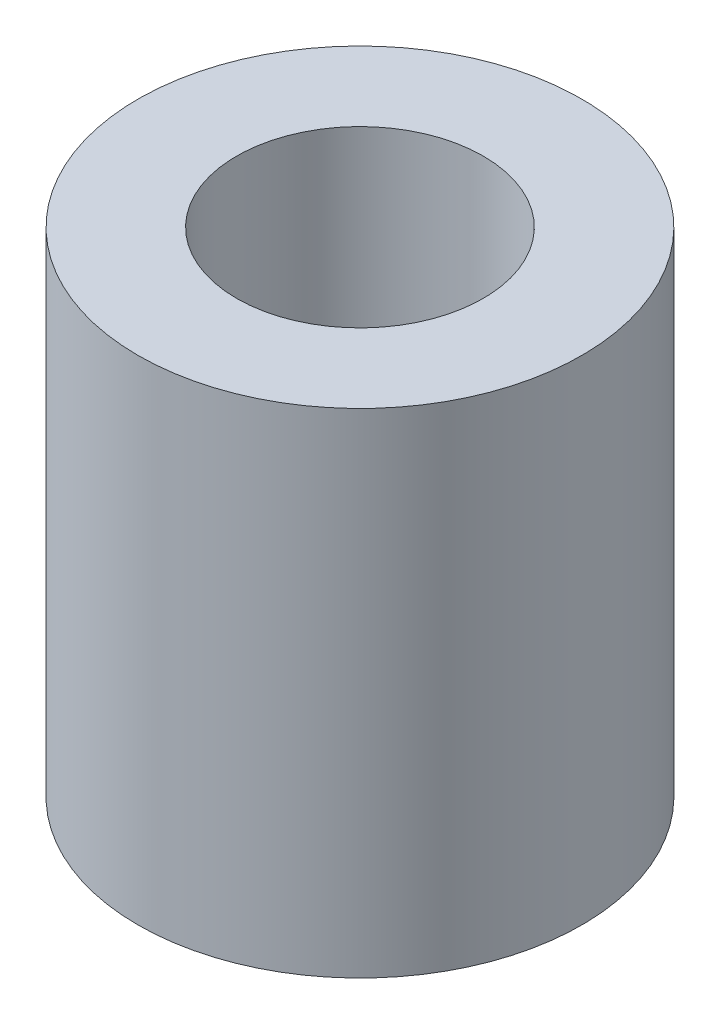
ISO-10303-21;
HEADER;
FILE_DESCRIPTION(('STEP AP214'),'2;1');
FILE_NAME('part.step','',(''),(''),'','','');
FILE_SCHEMA(('AUTOMOTIVE_DESIGN { 1 0 10303 214 1 1 1 1 }'));
ENDSEC;
DATA;
#1=APPLICATION_CONTEXT('core data for automotive mechanical design processes');
#2=APPLICATION_PROTOCOL_DEFINITION('international standard','automotive_design',2000,#1);
#3=PRODUCT_CONTEXT('',#1,'mechanical');
#4=PRODUCT('Part','Part','',(#3));
#5=PRODUCT_RELATED_PRODUCT_CATEGORY('part','',(#4));
#6=PRODUCT_DEFINITION_FORMATION('','',#4);
#7=PRODUCT_DEFINITION_CONTEXT('part definition',#1,'design');
#8=PRODUCT_DEFINITION('design','',#6,#7);
#9=PRODUCT_DEFINITION_SHAPE('','',#8);
#10=(LENGTH_UNIT() NAMED_UNIT(*) SI_UNIT(.MILLI.,.METRE.));
#11=(NAMED_UNIT(*) PLANE_ANGLE_UNIT() SI_UNIT($,.RADIAN.));
#12=(NAMED_UNIT(*) SI_UNIT($,.STERADIAN.) SOLID_ANGLE_UNIT());
#13=UNCERTAINTY_MEASURE_WITH_UNIT(LENGTH_MEASURE(1.E-05),#10,'distance_accuracy_value','');
#14=(GEOMETRIC_REPRESENTATION_CONTEXT(3) GLOBAL_UNCERTAINTY_ASSIGNED_CONTEXT((#13)) GLOBAL_UNIT_ASSIGNED_CONTEXT((#10,
#11,#12)) REPRESENTATION_CONTEXT('',''));
#15=CARTESIAN_POINT('',(0.,0.,0.));
#16=DIRECTION('',(0.,0.,1.));
#17=DIRECTION('',(1.,0.,0.));
#18=AXIS2_PLACEMENT_3D('',#15,#16,#17);
#19=CARTESIAN_POINT('',(0.,10.,0.));
#20=DIRECTION('',(0.,-1.,0.));
#21=DIRECTION('',(0.,0.,-1.));
#22=AXIS2_PLACEMENT_3D('',#19,#20,#21);
#23=CYLINDRICAL_SURFACE('',#22,4.5);
#24=CARTESIAN_POINT('',(0.,10.,0.));
#25=DIRECTION('',(0.,1.,0.));
#26=DIRECTION('',(0.,0.,1.));
#27=AXIS2_PLACEMENT_3D('',#24,#25,#26);
#28=CIRCLE('',#27,4.5);
#29=CARTESIAN_POINT('',(0.,10.,4.5));
#30=VERTEX_POINT('',#29);
#31=EDGE_CURVE('E10',#30,#30,#28,.T.);
#32=ORIENTED_EDGE('',*,*,#31,.F.);
#33=EDGE_LOOP('',(#32));
#34=FACE_BOUND('',#33,.T.);
#35=CARTESIAN_POINT('',(0.,0.,0.));
#36=DIRECTION('',(0.,1.,0.));
#37=DIRECTION('',(0.,0.,1.));
#38=AXIS2_PLACEMENT_3D('',#35,#36,#37);
#39=CIRCLE('',#38,4.5);
#40=CARTESIAN_POINT('',(0.,0.,4.5));
#41=VERTEX_POINT('',#40);
#42=EDGE_CURVE('E34',#41,#41,#39,.T.);
#43=ORIENTED_EDGE('',*,*,#42,.T.);
#44=EDGE_LOOP('',(#43));
#45=FACE_BOUND('',#44,.T.);
#46=ADVANCED_FACE('F31',(#34,#45),#23,.T.);
#47=CARTESIAN_POINT('',(0.,10.,0.));
#48=DIRECTION('',(0.,1.,0.));
#49=DIRECTION('',(0.,0.,1.));
#50=AXIS2_PLACEMENT_3D('',#47,#48,#49);
#51=PLANE('',#50);
#52=CARTESIAN_POINT('',(0.,10.,0.));
#53=DIRECTION('',(0.,1.,0.));
#54=DIRECTION('',(0.,0.,1.));
#55=AXIS2_PLACEMENT_3D('',#52,#53,#54);
#56=CIRCLE('',#55,2.5);
#57=CARTESIAN_POINT('',(0.,10.,2.5));
#58=VERTEX_POINT('',#57);
#59=EDGE_CURVE('E43',#58,#58,#56,.T.);
#60=ORIENTED_EDGE('',*,*,#59,.F.);
#61=EDGE_LOOP('',(#60));
#62=FACE_BOUND('',#61,.T.);
#63=ORIENTED_EDGE('',*,*,#31,.T.);
#64=EDGE_LOOP('',(#63));
#65=FACE_BOUND('',#64,.T.);
#66=ADVANCED_FACE('F58',(#62,#65),#51,.T.);
#67=CARTESIAN_POINT('',(0.,0.,0.));
#68=DIRECTION('',(0.,1.,0.));
#69=DIRECTION('',(0.,0.,1.));
#70=AXIS2_PLACEMENT_3D('',#67,#68,#69);
#71=PLANE('',#70);
#72=CARTESIAN_POINT('',(0.,0.,0.));
#73=DIRECTION('',(0.,1.,0.));
#74=DIRECTION('',(0.,0.,1.));
#75=AXIS2_PLACEMENT_3D('',#72,#73,#74);
#76=CIRCLE('',#75,2.5);
#77=CARTESIAN_POINT('',(0.,0.,2.5));
#78=VERTEX_POINT('',#77);
#79=EDGE_CURVE('E41',#78,#78,#76,.T.);
#80=ORIENTED_EDGE('',*,*,#79,.T.);
#81=EDGE_LOOP('',(#80));
#82=FACE_BOUND('',#81,.T.);
#83=ORIENTED_EDGE('',*,*,#42,.F.);
#84=EDGE_LOOP('',(#83));
#85=FACE_BOUND('',#84,.T.);
#86=ADVANCED_FACE('F49',(#82,#85),#71,.F.);
#87=CARTESIAN_POINT('',(0.,0.,0.));
#88=DIRECTION('',(0.,1.,0.));
#89=DIRECTION('',(0.,0.,1.));
#90=AXIS2_PLACEMENT_3D('',#87,#88,#89);
#91=CYLINDRICAL_SURFACE('',#90,2.5);
#92=ORIENTED_EDGE('',*,*,#79,.F.);
#93=EDGE_LOOP('',(#92));
#94=FACE_BOUND('',#93,.T.);
#95=ORIENTED_EDGE('',*,*,#59,.T.);
#96=EDGE_LOOP('',(#95));
#97=FACE_BOUND('',#96,.T.);
#98=ADVANCED_FACE('F52',(#94,#97),#91,.F.);
#99=CLOSED_SHELL('',(#46,#66,#86,#98));
#100=MANIFOLD_SOLID_BREP('B2',#99);
#101=ADVANCED_BREP_SHAPE_REPRESENTATION('',(#18,#100),#14);
#102=SHAPE_DEFINITION_REPRESENTATION(#9,#101);
ENDSEC;
END-ISO-10303-21;
